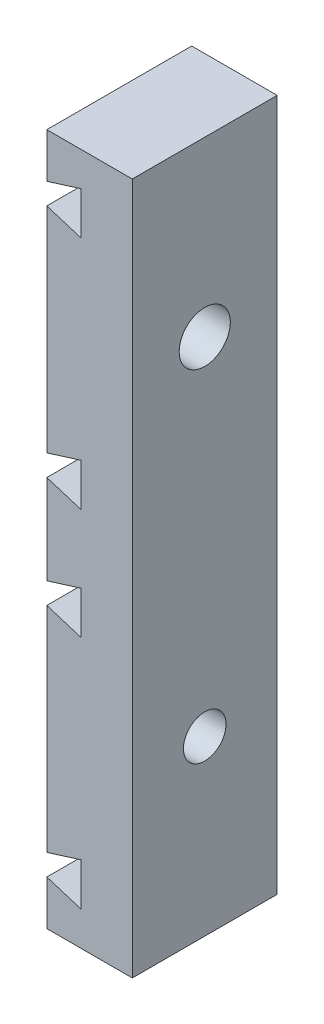
ISO-10303-21;
HEADER;
FILE_DESCRIPTION(('STEP AP214'),'2;1');
FILE_NAME('part.step','',(''),(''),'','','');
FILE_SCHEMA(('AUTOMOTIVE_DESIGN { 1 0 10303 214 1 1 1 1 }'));
ENDSEC;
DATA;
#1=APPLICATION_CONTEXT('core data for automotive mechanical design processes');
#2=APPLICATION_PROTOCOL_DEFINITION('international standard','automotive_design',2000,#1);
#3=PRODUCT_CONTEXT('',#1,'mechanical');
#4=PRODUCT('Part','Part','',(#3));
#5=PRODUCT_RELATED_PRODUCT_CATEGORY('part','',(#4));
#6=PRODUCT_DEFINITION_FORMATION('','',#4);
#7=PRODUCT_DEFINITION_CONTEXT('part definition',#1,'design');
#8=PRODUCT_DEFINITION('design','',#6,#7);
#9=PRODUCT_DEFINITION_SHAPE('','',#8);
#10=(LENGTH_UNIT() NAMED_UNIT(*) SI_UNIT(.MILLI.,.METRE.));
#11=(NAMED_UNIT(*) PLANE_ANGLE_UNIT() SI_UNIT($,.RADIAN.));
#12=(NAMED_UNIT(*) SI_UNIT($,.STERADIAN.) SOLID_ANGLE_UNIT());
#13=UNCERTAINTY_MEASURE_WITH_UNIT(LENGTH_MEASURE(1.E-05),#10,'distance_accuracy_value','');
#14=(GEOMETRIC_REPRESENTATION_CONTEXT(3) GLOBAL_UNCERTAINTY_ASSIGNED_CONTEXT((#13)) GLOBAL_UNIT_ASSIGNED_CONTEXT((#10,
#11,#12)) REPRESENTATION_CONTEXT('',''));
#15=CARTESIAN_POINT('',(0.,0.,0.));
#16=DIRECTION('',(0.,0.,1.));
#17=DIRECTION('',(1.,0.,0.));
#18=AXIS2_PLACEMENT_3D('',#15,#16,#17);
#19=CARTESIAN_POINT('',(15.1656478378989,20.3,4.25));
#20=DIRECTION('',(-1.,0.,0.));
#21=DIRECTION('',(0.,0.,1.));
#22=AXIS2_PLACEMENT_3D('',#19,#20,#21);
#23=CYLINDRICAL_SURFACE('',#22,1.5);
#24=CARTESIAN_POINT('',(15.1656478378989,20.3,4.25));
#25=DIRECTION('',(-1.,0.,0.));
#26=DIRECTION('',(0.,0.,1.));
#27=AXIS2_PLACEMENT_3D('',#24,#25,#26);
#28=CIRCLE('',#27,1.5);
#29=CARTESIAN_POINT('',(15.1656478378989,20.3,5.75));
#30=VERTEX_POINT('',#29);
#31=EDGE_CURVE('E363',#30,#30,#28,.T.);
#32=ORIENTED_EDGE('',*,*,#31,.F.);
#33=EDGE_LOOP('',(#32));
#34=FACE_BOUND('',#33,.T.);
#35=CARTESIAN_POINT('',(12.65,20.3,4.25));
#36=DIRECTION('',(-1.,0.,0.));
#37=DIRECTION('',(0.,0.,1.));
#38=AXIS2_PLACEMENT_3D('',#35,#36,#37);
#39=CIRCLE('',#38,1.5);
#40=CARTESIAN_POINT('',(12.65,20.3,5.75));
#41=VERTEX_POINT('',#40);
#42=EDGE_CURVE('E43',#41,#41,#39,.F.);
#43=ORIENTED_EDGE('',*,*,#42,.F.);
#44=EDGE_LOOP('',(#43));
#45=FACE_BOUND('',#44,.T.);
#46=ADVANCED_FACE('F39',(#34,#45),#23,.F.);
#47=CARTESIAN_POINT('',(18.65,0.,4.25));
#48=DIRECTION('',(-1.,0.,0.));
#49=DIRECTION('',(0.,0.,1.));
#50=AXIS2_PLACEMENT_3D('',#47,#48,#49);
#51=CYLINDRICAL_SURFACE('',#50,1.25);
#52=CARTESIAN_POINT('',(15.1656478378989,0.,4.25));
#53=DIRECTION('',(-1.,0.,0.));
#54=DIRECTION('',(0.,0.,1.));
#55=AXIS2_PLACEMENT_3D('',#52,#53,#54);
#56=CIRCLE('',#55,1.25);
#57=CARTESIAN_POINT('',(15.1656478378989,0.,5.5));
#58=VERTEX_POINT('',#57);
#59=EDGE_CURVE('E165',#58,#58,#56,.T.);
#60=ORIENTED_EDGE('',*,*,#59,.F.);
#61=EDGE_LOOP('',(#60));
#62=FACE_BOUND('',#61,.T.);
#63=CARTESIAN_POINT('',(12.65,0.,4.25));
#64=DIRECTION('',(-1.,0.,0.));
#65=DIRECTION('',(0.,0.,1.));
#66=AXIS2_PLACEMENT_3D('',#63,#64,#65);
#67=CIRCLE('',#66,1.25);
#68=CARTESIAN_POINT('',(12.65,0.,5.5));
#69=VERTEX_POINT('',#68);
#70=EDGE_CURVE('E217',#69,#69,#67,.F.);
#71=ORIENTED_EDGE('',*,*,#70,.F.);
#72=EDGE_LOOP('',(#71));
#73=FACE_BOUND('',#72,.T.);
#74=ADVANCED_FACE('F415',(#62,#73),#51,.F.);
#75=CARTESIAN_POINT('',(15.1656478378989,10.15,8.5));
#76=DIRECTION('',(-1.,0.,0.));
#77=DIRECTION('',(0.,0.,1.));
#78=AXIS2_PLACEMENT_3D('',#75,#76,#77);
#79=PLANE('',#78);
#80=ORIENTED_EDGE('',*,*,#31,.T.);
#81=EDGE_LOOP('',(#80));
#82=FACE_BOUND('',#81,.T.);
#83=ORIENTED_EDGE('',*,*,#59,.T.);
#84=EDGE_LOOP('',(#83));
#85=FACE_BOUND('',#84,.T.);
#86=DIRECTION('',(0.,1.,0.));
#87=VECTOR('',#86,1.);
#88=CARTESIAN_POINT('',(15.1656478378989,10.15,0.));
#89=LINE('',#88,#87);
#90=CARTESIAN_POINT('',(15.1656478378989,-10.15,0.));
#91=VERTEX_POINT('',#90);
#92=CARTESIAN_POINT('',(15.1656478378989,30.45,0.));
#93=VERTEX_POINT('',#92);
#94=EDGE_CURVE('E160',#91,#93,#89,.T.);
#95=ORIENTED_EDGE('',*,*,#94,.T.);
#96=DIRECTION('',(0.,0.,-1.));
#97=VECTOR('',#96,1.);
#98=CARTESIAN_POINT('',(15.1656478378989,30.45,8.5));
#99=LINE('',#98,#97);
#100=CARTESIAN_POINT('',(15.1656478378989,30.45,8.5));
#101=VERTEX_POINT('',#100);
#102=EDGE_CURVE('E234',#101,#93,#99,.T.);
#103=ORIENTED_EDGE('',*,*,#102,.F.);
#104=DIRECTION('',(0.,1.,0.));
#105=VECTOR('',#104,1.);
#106=CARTESIAN_POINT('',(15.1656478378989,10.15,8.5));
#107=LINE('',#106,#105);
#108=CARTESIAN_POINT('',(15.1656478378989,-10.15,8.5));
#109=VERTEX_POINT('',#108);
#110=EDGE_CURVE('E192',#109,#101,#107,.T.);
#111=ORIENTED_EDGE('',*,*,#110,.F.);
#112=DIRECTION('',(0.,0.,-1.));
#113=VECTOR('',#112,1.);
#114=CARTESIAN_POINT('',(15.1656478378989,-10.15,8.5));
#115=LINE('',#114,#113);
#116=EDGE_CURVE('E156',#109,#91,#115,.T.);
#117=ORIENTED_EDGE('',*,*,#116,.T.);
#118=EDGE_LOOP('',(#95,#103,#111,#117));
#119=FACE_BOUND('',#118,.T.);
#120=ADVANCED_FACE('F41',(#82,#85,#119),#79,.F.);
#121=CARTESIAN_POINT('',(10.15,10.15,8.5));
#122=DIRECTION('',(1.,0.,0.));
#123=DIRECTION('',(0.,0.,-1.));
#124=AXIS2_PLACEMENT_3D('',#121,#122,#123);
#125=PLANE('',#124);
#126=DIRECTION('',(0.,-1.,0.));
#127=VECTOR('',#126,1.);
#128=CARTESIAN_POINT('',(10.15,10.15,0.));
#129=LINE('',#128,#127);
#130=CARTESIAN_POINT('',(10.15,12.775,0.));
#131=VERTEX_POINT('',#130);
#132=CARTESIAN_POINT('',(10.15,7.525,0.));
#133=VERTEX_POINT('',#132);
#134=EDGE_CURVE('E164',#131,#133,#129,.T.);
#135=ORIENTED_EDGE('',*,*,#134,.T.);
#136=DIRECTION('',(0.,0.,-1.));
#137=VECTOR('',#136,1.);
#138=CARTESIAN_POINT('',(10.15,7.525,8.5));
#139=LINE('',#138,#137);
#140=CARTESIAN_POINT('',(10.15,7.525,8.5));
#141=VERTEX_POINT('',#140);
#142=EDGE_CURVE('E11',#141,#133,#139,.T.);
#143=ORIENTED_EDGE('',*,*,#142,.F.);
#144=DIRECTION('',(0.,-1.,0.));
#145=VECTOR('',#144,1.);
#146=CARTESIAN_POINT('',(10.15,10.15,8.5));
#147=LINE('',#146,#145);
#148=CARTESIAN_POINT('',(10.15,12.775,8.5));
#149=VERTEX_POINT('',#148);
#150=EDGE_CURVE('E109',#149,#141,#147,.T.);
#151=ORIENTED_EDGE('',*,*,#150,.F.);
#152=DIRECTION('',(0.,0.,-1.));
#153=VECTOR('',#152,1.);
#154=CARTESIAN_POINT('',(10.15,12.775,8.5));
#155=LINE('',#154,#153);
#156=EDGE_CURVE('E325',#149,#131,#155,.T.);
#157=ORIENTED_EDGE('',*,*,#156,.T.);
#158=EDGE_LOOP('',(#135,#143,#151,#157));
#159=FACE_BOUND('',#158,.T.);
#160=ADVANCED_FACE('F498',(#159),#125,.F.);
#161=CARTESIAN_POINT('',(12.15,8.15,8.5));
#162=DIRECTION('',(-0.298274993135945,0.95447997803503,0.));
#163=DIRECTION('',(-0.95447997803503,-0.298274993135945,0.));
#164=AXIS2_PLACEMENT_3D('',#161,#162,#163);
#165=PLANE('',#164);
#166=DIRECTION('',(0.95447997803503,0.298274993135945,0.));
#167=VECTOR('',#166,1.);
#168=CARTESIAN_POINT('',(12.15,8.15,0.));
#169=LINE('',#168,#167);
#170=CARTESIAN_POINT('',(12.15,8.15,0.));
#171=VERTEX_POINT('',#170);
#172=EDGE_CURVE('E168',#133,#171,#169,.T.);
#173=ORIENTED_EDGE('',*,*,#172,.T.);
#174=DIRECTION('',(0.,0.,-1.));
#175=VECTOR('',#174,1.);
#176=CARTESIAN_POINT('',(12.15,8.15,8.5));
#177=LINE('',#176,#175);
#178=CARTESIAN_POINT('',(12.15,8.15,8.5));
#179=VERTEX_POINT('',#178);
#180=EDGE_CURVE('E50',#179,#171,#177,.T.);
#181=ORIENTED_EDGE('',*,*,#180,.F.);
#182=DIRECTION('',(0.95447997803503,0.298274993135945,0.));
#183=VECTOR('',#182,1.);
#184=CARTESIAN_POINT('',(12.15,8.15,8.5));
#185=LINE('',#184,#183);
#186=EDGE_CURVE('E243',#141,#179,#185,.T.);
#187=ORIENTED_EDGE('',*,*,#186,.F.);
#188=ORIENTED_EDGE('',*,*,#142,.T.);
#189=EDGE_LOOP('',(#173,#181,#187,#188));
#190=FACE_BOUND('',#189,.T.);
#191=ADVANCED_FACE('F495',(#190),#165,.F.);
#192=CARTESIAN_POINT('',(12.15,8.15,8.5));
#193=DIRECTION('',(1.,0.,0.));
#194=DIRECTION('',(0.,0.,-1.));
#195=AXIS2_PLACEMENT_3D('',#192,#193,#194);
#196=PLANE('',#195);
#197=DIRECTION('',(0.,-1.,0.));
#198=VECTOR('',#197,1.);
#199=CARTESIAN_POINT('',(12.15,8.15,0.));
#200=LINE('',#199,#198);
#201=CARTESIAN_POINT('',(12.15,5.65,0.));
#202=VERTEX_POINT('',#201);
#203=EDGE_CURVE('E171',#171,#202,#200,.T.);
#204=ORIENTED_EDGE('',*,*,#203,.T.);
#205=DIRECTION('',(0.,0.,-1.));
#206=VECTOR('',#205,1.);
#207=CARTESIAN_POINT('',(12.15,5.65,8.5));
#208=LINE('',#207,#206);
#209=CARTESIAN_POINT('',(12.15,5.65,8.5));
#210=VERTEX_POINT('',#209);
#211=EDGE_CURVE('E211',#210,#202,#208,.T.);
#212=ORIENTED_EDGE('',*,*,#211,.F.);
#213=DIRECTION('',(0.,-1.,0.));
#214=VECTOR('',#213,1.);
#215=CARTESIAN_POINT('',(12.15,8.15,8.5));
#216=LINE('',#215,#214);
#217=EDGE_CURVE('E246',#179,#210,#216,.T.);
#218=ORIENTED_EDGE('',*,*,#217,.F.);
#219=ORIENTED_EDGE('',*,*,#180,.T.);
#220=EDGE_LOOP('',(#204,#212,#218,#219));
#221=FACE_BOUND('',#220,.T.);
#222=ADVANCED_FACE('F491',(#221),#196,.F.);
#223=CARTESIAN_POINT('',(12.15,5.65,8.5));
#224=DIRECTION('',(-0.298274993135947,-0.95447997803503,0.));
#225=DIRECTION('',(0.95447997803503,-0.298274993135947,0.));
#226=AXIS2_PLACEMENT_3D('',#223,#224,#225);
#227=PLANE('',#226);
#228=DIRECTION('',(-0.95447997803503,0.298274993135947,0.));
#229=VECTOR('',#228,1.);
#230=CARTESIAN_POINT('',(12.15,5.65,0.));
#231=LINE('',#230,#229);
#232=CARTESIAN_POINT('',(10.15,6.275,0.));
#233=VERTEX_POINT('',#232);
#234=EDGE_CURVE('E174',#202,#233,#231,.T.);
#235=ORIENTED_EDGE('',*,*,#234,.T.);
#236=DIRECTION('',(0.,0.,-1.));
#237=VECTOR('',#236,1.);
#238=CARTESIAN_POINT('',(10.15,6.275,8.5));
#239=LINE('',#238,#237);
#240=CARTESIAN_POINT('',(10.15,6.275,8.5));
#241=VERTEX_POINT('',#240);
#242=EDGE_CURVE('E207',#241,#233,#239,.T.);
#243=ORIENTED_EDGE('',*,*,#242,.F.);
#244=DIRECTION('',(-0.95447997803503,0.298274993135947,0.));
#245=VECTOR('',#244,1.);
#246=CARTESIAN_POINT('',(12.15,5.65,8.5));
#247=LINE('',#246,#245);
#248=EDGE_CURVE('E249',#210,#241,#247,.T.);
#249=ORIENTED_EDGE('',*,*,#248,.F.);
#250=ORIENTED_EDGE('',*,*,#211,.T.);
#251=EDGE_LOOP('',(#235,#243,#249,#250));
#252=FACE_BOUND('',#251,.T.);
#253=ADVANCED_FACE('F487',(#252),#227,.F.);
#254=CARTESIAN_POINT('',(10.15,6.275,8.5));
#255=DIRECTION('',(1.,0.,0.));
#256=DIRECTION('',(0.,0.,-1.));
#257=AXIS2_PLACEMENT_3D('',#254,#255,#256);
#258=PLANE('',#257);
#259=CARTESIAN_POINT('',(10.15,0.,4.25));
#260=DIRECTION('',(-1.,0.,0.));
#261=DIRECTION('',(0.,0.,1.));
#262=AXIS2_PLACEMENT_3D('',#259,#260,#261);
#263=CIRCLE('',#262,3.);
#264=CARTESIAN_POINT('',(10.15,0.,7.25));
#265=VERTEX_POINT('',#264);
#266=EDGE_CURVE('E228',#265,#265,#263,.T.);
#267=ORIENTED_EDGE('',*,*,#266,.F.);
#268=EDGE_LOOP('',(#267));
#269=FACE_BOUND('',#268,.T.);
#270=DIRECTION('',(0.,-1.,0.));
#271=VECTOR('',#270,1.);
#272=CARTESIAN_POINT('',(10.15,6.275,0.));
#273=LINE('',#272,#271);
#274=CARTESIAN_POINT('',(10.15,-6.275,0.));
#275=VERTEX_POINT('',#274);
#276=EDGE_CURVE('E177',#233,#275,#273,.T.);
#277=ORIENTED_EDGE('',*,*,#276,.T.);
#278=DIRECTION('',(0.,0.,-1.));
#279=VECTOR('',#278,1.);
#280=CARTESIAN_POINT('',(10.15,-6.275,8.5));
#281=LINE('',#280,#279);
#282=CARTESIAN_POINT('',(10.15,-6.275,8.5));
#283=VERTEX_POINT('',#282);
#284=EDGE_CURVE('E203',#283,#275,#281,.T.);
#285=ORIENTED_EDGE('',*,*,#284,.F.);
#286=DIRECTION('',(0.,-1.,0.));
#287=VECTOR('',#286,1.);
#288=CARTESIAN_POINT('',(10.15,6.275,8.5));
#289=LINE('',#288,#287);
#290=EDGE_CURVE('E252',#241,#283,#289,.T.);
#291=ORIENTED_EDGE('',*,*,#290,.F.);
#292=ORIENTED_EDGE('',*,*,#242,.T.);
#293=EDGE_LOOP('',(#277,#285,#291,#292));
#294=FACE_BOUND('',#293,.T.);
#295=ADVANCED_FACE('F484',(#269,#294),#258,.F.);
#296=CARTESIAN_POINT('',(12.15,-5.65,8.5));
#297=DIRECTION('',(-0.298274993135949,0.954479978035029,0.));
#298=DIRECTION('',(-0.954479978035029,-0.298274993135949,0.));
#299=AXIS2_PLACEMENT_3D('',#296,#297,#298);
#300=PLANE('',#299);
#301=DIRECTION('',(0.954479978035029,0.298274993135949,0.));
#302=VECTOR('',#301,1.);
#303=CARTESIAN_POINT('',(12.15,-5.65,0.));
#304=LINE('',#303,#302);
#305=CARTESIAN_POINT('',(12.15,-5.65,0.));
#306=VERTEX_POINT('',#305);
#307=EDGE_CURVE('E180',#275,#306,#304,.T.);
#308=ORIENTED_EDGE('',*,*,#307,.T.);
#309=DIRECTION('',(0.,0.,-1.));
#310=VECTOR('',#309,1.);
#311=CARTESIAN_POINT('',(12.15,-5.65,8.5));
#312=LINE('',#311,#310);
#313=CARTESIAN_POINT('',(12.15,-5.65,8.5));
#314=VERTEX_POINT('',#313);
#315=EDGE_CURVE('E199',#314,#306,#312,.T.);
#316=ORIENTED_EDGE('',*,*,#315,.F.);
#317=DIRECTION('',(0.954479978035029,0.298274993135949,0.));
#318=VECTOR('',#317,1.);
#319=CARTESIAN_POINT('',(12.15,-5.65,8.5));
#320=LINE('',#319,#318);
#321=EDGE_CURVE('E255',#283,#314,#320,.T.);
#322=ORIENTED_EDGE('',*,*,#321,.F.);
#323=ORIENTED_EDGE('',*,*,#284,.T.);
#324=EDGE_LOOP('',(#308,#316,#322,#323));
#325=FACE_BOUND('',#324,.T.);
#326=ADVANCED_FACE('F263',(#325),#300,.F.);
#327=CARTESIAN_POINT('',(12.15,-5.65,8.5));
#328=DIRECTION('',(1.,0.,0.));
#329=DIRECTION('',(0.,0.,-1.));
#330=AXIS2_PLACEMENT_3D('',#327,#328,#329);
#331=PLANE('',#330);
#332=DIRECTION('',(0.,-1.,0.));
#333=VECTOR('',#332,1.);
#334=CARTESIAN_POINT('',(12.15,-5.65,0.));
#335=LINE('',#334,#333);
#336=CARTESIAN_POINT('',(12.15,-8.15,0.));
#337=VERTEX_POINT('',#336);
#338=EDGE_CURVE('E183',#306,#337,#335,.T.);
#339=ORIENTED_EDGE('',*,*,#338,.T.);
#340=DIRECTION('',(0.,0.,-1.));
#341=VECTOR('',#340,1.);
#342=CARTESIAN_POINT('',(12.15,-8.15,8.5));
#343=LINE('',#342,#341);
#344=CARTESIAN_POINT('',(12.15,-8.15,8.5));
#345=VERTEX_POINT('',#344);
#346=EDGE_CURVE('E149',#345,#337,#343,.T.);
#347=ORIENTED_EDGE('',*,*,#346,.F.);
#348=DIRECTION('',(0.,-1.,0.));
#349=VECTOR('',#348,1.);
#350=CARTESIAN_POINT('',(12.15,-5.65,8.5));
#351=LINE('',#350,#349);
#352=EDGE_CURVE('E138',#314,#345,#351,.T.);
#353=ORIENTED_EDGE('',*,*,#352,.F.);
#354=ORIENTED_EDGE('',*,*,#315,.T.);
#355=EDGE_LOOP('',(#339,#347,#353,#354));
#356=FACE_BOUND('',#355,.T.);
#357=ADVANCED_FACE('F267',(#356),#331,.F.);
#358=CARTESIAN_POINT('',(12.15,-8.15,8.5));
#359=DIRECTION('',(-0.298274993135951,-0.954479978035029,0.));
#360=DIRECTION('',(0.954479978035028,-0.298274993135951,0.));
#361=AXIS2_PLACEMENT_3D('',#358,#359,#360);
#362=PLANE('',#361);
#363=DIRECTION('',(-0.954479978035028,0.298274993135951,0.));
#364=VECTOR('',#363,1.);
#365=CARTESIAN_POINT('',(12.15,-8.15,0.));
#366=LINE('',#365,#364);
#367=CARTESIAN_POINT('',(10.15,-7.525,0.));
#368=VERTEX_POINT('',#367);
#369=EDGE_CURVE('E147',#337,#368,#366,.T.);
#370=ORIENTED_EDGE('',*,*,#369,.T.);
#371=DIRECTION('',(0.,0.,-1.));
#372=VECTOR('',#371,1.);
#373=CARTESIAN_POINT('',(10.15,-7.525,8.5));
#374=LINE('',#373,#372);
#375=CARTESIAN_POINT('',(10.15,-7.525,8.5));
#376=VERTEX_POINT('',#375);
#377=EDGE_CURVE('E144',#376,#368,#374,.T.);
#378=ORIENTED_EDGE('',*,*,#377,.F.);
#379=DIRECTION('',(-0.954479978035028,0.298274993135951,0.));
#380=VECTOR('',#379,1.);
#381=CARTESIAN_POINT('',(12.15,-8.15,8.5));
#382=LINE('',#381,#380);
#383=EDGE_CURVE('E132',#345,#376,#382,.T.);
#384=ORIENTED_EDGE('',*,*,#383,.F.);
#385=ORIENTED_EDGE('',*,*,#346,.T.);
#386=EDGE_LOOP('',(#370,#378,#384,#385));
#387=FACE_BOUND('',#386,.T.);
#388=ADVANCED_FACE('F145',(#387),#362,.F.);
#389=CARTESIAN_POINT('',(10.15,-7.525,8.5));
#390=DIRECTION('',(1.,0.,0.));
#391=DIRECTION('',(0.,1.,0.));
#392=AXIS2_PLACEMENT_3D('',#389,#390,#391);
#393=PLANE('',#392);
#394=DIRECTION('',(0.,-1.,0.));
#395=VECTOR('',#394,1.);
#396=CARTESIAN_POINT('',(10.15,-7.525,0.));
#397=LINE('',#396,#395);
#398=CARTESIAN_POINT('',(10.15,-10.15,0.));
#399=VERTEX_POINT('',#398);
#400=EDGE_CURVE('E95',#368,#399,#397,.T.);
#401=ORIENTED_EDGE('',*,*,#400,.T.);
#402=DIRECTION('',(0.,0.,-1.));
#403=VECTOR('',#402,1.);
#404=CARTESIAN_POINT('',(10.15,-10.15,8.5));
#405=LINE('',#404,#403);
#406=CARTESIAN_POINT('',(10.15,-10.15,8.5));
#407=VERTEX_POINT('',#406);
#408=EDGE_CURVE('E150',#407,#399,#405,.T.);
#409=ORIENTED_EDGE('',*,*,#408,.F.);
#410=DIRECTION('',(0.,-1.,0.));
#411=VECTOR('',#410,1.);
#412=CARTESIAN_POINT('',(10.15,-7.525,8.5));
#413=LINE('',#412,#411);
#414=EDGE_CURVE('E136',#376,#407,#413,.T.);
#415=ORIENTED_EDGE('',*,*,#414,.F.);
#416=ORIENTED_EDGE('',*,*,#377,.T.);
#417=EDGE_LOOP('',(#401,#409,#415,#416));
#418=FACE_BOUND('',#417,.T.);
#419=ADVANCED_FACE('F152',(#418),#393,.F.);
#420=CARTESIAN_POINT('',(15.1656478378989,-10.15,8.5));
#421=DIRECTION('',(0.,1.,0.));
#422=DIRECTION('',(0.,0.,1.));
#423=AXIS2_PLACEMENT_3D('',#420,#421,#422);
#424=PLANE('',#423);
#425=DIRECTION('',(1.,0.,0.));
#426=VECTOR('',#425,1.);
#427=CARTESIAN_POINT('',(15.1656478378989,-10.15,0.));
#428=LINE('',#427,#426);
#429=EDGE_CURVE('E101',#399,#91,#428,.T.);
#430=ORIENTED_EDGE('',*,*,#429,.T.);
#431=ORIENTED_EDGE('',*,*,#116,.F.);
#432=DIRECTION('',(1.,0.,0.));
#433=VECTOR('',#432,1.);
#434=CARTESIAN_POINT('',(15.1656478378989,-10.15,8.5));
#435=LINE('',#434,#433);
#436=EDGE_CURVE('E59',#407,#109,#435,.T.);
#437=ORIENTED_EDGE('',*,*,#436,.F.);
#438=ORIENTED_EDGE('',*,*,#408,.T.);
#439=EDGE_LOOP('',(#430,#431,#437,#438));
#440=FACE_BOUND('',#439,.T.);
#441=ADVANCED_FACE('F471',(#440),#424,.F.);
#442=CARTESIAN_POINT('',(0.,0.,8.5));
#443=DIRECTION('',(0.,0.,-1.));
#444=DIRECTION('',(-1.,0.,0.));
#445=AXIS2_PLACEMENT_3D('',#442,#443,#444);
#446=PLANE('',#445);
#447=ORIENTED_EDGE('',*,*,#110,.T.);
#448=DIRECTION('',(1.,0.,0.));
#449=VECTOR('',#448,1.);
#450=CARTESIAN_POINT('',(15.1656478378989,30.45,8.5));
#451=LINE('',#450,#449);
#452=CARTESIAN_POINT('',(10.15,30.45,8.5));
#453=VERTEX_POINT('',#452);
#454=EDGE_CURVE('E288',#453,#101,#451,.T.);
#455=ORIENTED_EDGE('',*,*,#454,.F.);
#456=DIRECTION('',(0.,1.,0.));
#457=VECTOR('',#456,1.);
#458=CARTESIAN_POINT('',(10.15,27.825,8.5));
#459=LINE('',#458,#457);
#460=CARTESIAN_POINT('',(10.15,27.825,8.5));
#461=VERTEX_POINT('',#460);
#462=EDGE_CURVE('E391',#461,#453,#459,.T.);
#463=ORIENTED_EDGE('',*,*,#462,.F.);
#464=DIRECTION('',(-0.954479978035028,-0.298274993135951,0.));
#465=VECTOR('',#464,1.);
#466=CARTESIAN_POINT('',(12.15,28.45,8.5));
#467=LINE('',#466,#465);
#468=CARTESIAN_POINT('',(12.15,28.45,8.5));
#469=VERTEX_POINT('',#468);
#470=EDGE_CURVE('E387',#469,#461,#467,.T.);
#471=ORIENTED_EDGE('',*,*,#470,.F.);
#472=DIRECTION('',(0.,1.,0.));
#473=VECTOR('',#472,1.);
#474=CARTESIAN_POINT('',(12.15,25.95,8.5));
#475=LINE('',#474,#473);
#476=CARTESIAN_POINT('',(12.15,25.95,8.5));
#477=VERTEX_POINT('',#476);
#478=EDGE_CURVE('E383',#477,#469,#475,.T.);
#479=ORIENTED_EDGE('',*,*,#478,.F.);
#480=DIRECTION('',(0.954479978035029,-0.298274993135949,0.));
#481=VECTOR('',#480,1.);
#482=CARTESIAN_POINT('',(12.15,25.95,8.5));
#483=LINE('',#482,#481);
#484=CARTESIAN_POINT('',(10.15,26.575,8.5));
#485=VERTEX_POINT('',#484);
#486=EDGE_CURVE('E379',#485,#477,#483,.T.);
#487=ORIENTED_EDGE('',*,*,#486,.F.);
#488=DIRECTION('',(0.,1.,0.));
#489=VECTOR('',#488,1.);
#490=CARTESIAN_POINT('',(10.15,14.025,8.5));
#491=LINE('',#490,#489);
#492=CARTESIAN_POINT('',(10.15,14.025,8.5));
#493=VERTEX_POINT('',#492);
#494=EDGE_CURVE('E375',#493,#485,#491,.T.);
#495=ORIENTED_EDGE('',*,*,#494,.F.);
#496=DIRECTION('',(-0.95447997803503,-0.298274993135947,0.));
#497=VECTOR('',#496,1.);
#498=CARTESIAN_POINT('',(12.15,14.65,8.5));
#499=LINE('',#498,#497);
#500=CARTESIAN_POINT('',(12.15,14.65,8.5));
#501=VERTEX_POINT('',#500);
#502=EDGE_CURVE('E371',#501,#493,#499,.T.);
#503=ORIENTED_EDGE('',*,*,#502,.F.);
#504=DIRECTION('',(0.,1.,0.));
#505=VECTOR('',#504,1.);
#506=CARTESIAN_POINT('',(12.15,12.15,8.5));
#507=LINE('',#506,#505);
#508=CARTESIAN_POINT('',(12.15,12.15,8.5));
#509=VERTEX_POINT('',#508);
#510=EDGE_CURVE('E367',#509,#501,#507,.T.);
#511=ORIENTED_EDGE('',*,*,#510,.F.);
#512=DIRECTION('',(0.95447997803503,-0.298274993135945,0.));
#513=VECTOR('',#512,1.);
#514=CARTESIAN_POINT('',(12.15,12.15,8.5));
#515=LINE('',#514,#513);
#516=EDGE_CURVE('E329',#149,#509,#515,.T.);
#517=ORIENTED_EDGE('',*,*,#516,.F.);
#518=ORIENTED_EDGE('',*,*,#150,.T.);
#519=ORIENTED_EDGE('',*,*,#186,.T.);
#520=ORIENTED_EDGE('',*,*,#217,.T.);
#521=ORIENTED_EDGE('',*,*,#248,.T.);
#522=ORIENTED_EDGE('',*,*,#290,.T.);
#523=ORIENTED_EDGE('',*,*,#321,.T.);
#524=ORIENTED_EDGE('',*,*,#352,.T.);
#525=ORIENTED_EDGE('',*,*,#383,.T.);
#526=ORIENTED_EDGE('',*,*,#414,.T.);
#527=ORIENTED_EDGE('',*,*,#436,.T.);
#528=EDGE_LOOP('',(#447,#455,#463,#471,#479,#487,#495,#503,#511,#517,#518,#519,#520,#521,#522,
#523,#524,#525,#526,#527));
#529=FACE_BOUND('',#528,.T.);
#530=ADVANCED_FACE('F134',(#529),#446,.F.);
#531=CARTESIAN_POINT('',(0.,0.,0.));
#532=DIRECTION('',(0.,0.,-1.));
#533=DIRECTION('',(-1.,0.,0.));
#534=AXIS2_PLACEMENT_3D('',#531,#532,#533);
#535=PLANE('',#534);
#536=ORIENTED_EDGE('',*,*,#94,.F.);
#537=ORIENTED_EDGE('',*,*,#429,.F.);
#538=ORIENTED_EDGE('',*,*,#400,.F.);
#539=ORIENTED_EDGE('',*,*,#369,.F.);
#540=ORIENTED_EDGE('',*,*,#338,.F.);
#541=ORIENTED_EDGE('',*,*,#307,.F.);
#542=ORIENTED_EDGE('',*,*,#276,.F.);
#543=ORIENTED_EDGE('',*,*,#234,.F.);
#544=ORIENTED_EDGE('',*,*,#203,.F.);
#545=ORIENTED_EDGE('',*,*,#172,.F.);
#546=ORIENTED_EDGE('',*,*,#134,.F.);
#547=DIRECTION('',(0.95447997803503,-0.298274993135945,0.));
#548=VECTOR('',#547,1.);
#549=CARTESIAN_POINT('',(12.15,12.15,0.));
#550=LINE('',#549,#548);
#551=CARTESIAN_POINT('',(12.15,12.15,0.));
#552=VERTEX_POINT('',#551);
#553=EDGE_CURVE('E330',#131,#552,#550,.T.);
#554=ORIENTED_EDGE('',*,*,#553,.T.);
#555=DIRECTION('',(0.,1.,0.));
#556=VECTOR('',#555,1.);
#557=CARTESIAN_POINT('',(12.15,12.15,0.));
#558=LINE('',#557,#556);
#559=CARTESIAN_POINT('',(12.15,14.65,0.));
#560=VERTEX_POINT('',#559);
#561=EDGE_CURVE('E334',#552,#560,#558,.T.);
#562=ORIENTED_EDGE('',*,*,#561,.T.);
#563=DIRECTION('',(-0.95447997803503,-0.298274993135947,0.));
#564=VECTOR('',#563,1.);
#565=CARTESIAN_POINT('',(12.15,14.65,0.));
#566=LINE('',#565,#564);
#567=CARTESIAN_POINT('',(10.15,14.025,0.));
#568=VERTEX_POINT('',#567);
#569=EDGE_CURVE('E338',#560,#568,#566,.T.);
#570=ORIENTED_EDGE('',*,*,#569,.T.);
#571=DIRECTION('',(0.,1.,0.));
#572=VECTOR('',#571,1.);
#573=CARTESIAN_POINT('',(10.15,14.025,0.));
#574=LINE('',#573,#572);
#575=CARTESIAN_POINT('',(10.15,26.575,0.));
#576=VERTEX_POINT('',#575);
#577=EDGE_CURVE('E342',#568,#576,#574,.T.);
#578=ORIENTED_EDGE('',*,*,#577,.T.);
#579=DIRECTION('',(0.954479978035029,-0.298274993135949,0.));
#580=VECTOR('',#579,1.);
#581=CARTESIAN_POINT('',(12.15,25.95,0.));
#582=LINE('',#581,#580);
#583=CARTESIAN_POINT('',(12.15,25.95,0.));
#584=VERTEX_POINT('',#583);
#585=EDGE_CURVE('E346',#576,#584,#582,.T.);
#586=ORIENTED_EDGE('',*,*,#585,.T.);
#587=DIRECTION('',(0.,1.,0.));
#588=VECTOR('',#587,1.);
#589=CARTESIAN_POINT('',(12.15,25.95,0.));
#590=LINE('',#589,#588);
#591=CARTESIAN_POINT('',(12.15,28.45,0.));
#592=VERTEX_POINT('',#591);
#593=EDGE_CURVE('E350',#584,#592,#590,.T.);
#594=ORIENTED_EDGE('',*,*,#593,.T.);
#595=DIRECTION('',(-0.954479978035028,-0.298274993135951,0.));
#596=VECTOR('',#595,1.);
#597=CARTESIAN_POINT('',(12.15,28.45,0.));
#598=LINE('',#597,#596);
#599=CARTESIAN_POINT('',(10.15,27.825,0.));
#600=VERTEX_POINT('',#599);
#601=EDGE_CURVE('E354',#592,#600,#598,.T.);
#602=ORIENTED_EDGE('',*,*,#601,.T.);
#603=DIRECTION('',(0.,1.,0.));
#604=VECTOR('',#603,1.);
#605=CARTESIAN_POINT('',(10.15,27.825,0.));
#606=LINE('',#605,#604);
#607=CARTESIAN_POINT('',(10.15,30.45,0.));
#608=VERTEX_POINT('',#607);
#609=EDGE_CURVE('E358',#600,#608,#606,.T.);
#610=ORIENTED_EDGE('',*,*,#609,.T.);
#611=DIRECTION('',(1.,0.,0.));
#612=VECTOR('',#611,1.);
#613=CARTESIAN_POINT('',(15.1656478378989,30.45,0.));
#614=LINE('',#613,#612);
#615=EDGE_CURVE('E275',#608,#93,#614,.T.);
#616=ORIENTED_EDGE('',*,*,#615,.T.);
#617=EDGE_LOOP('',(#536,#537,#538,#539,#540,#541,#542,#543,#544,#545,#546,#554,#562,#570,#578,
#586,#594,#602,#610,#616));
#618=FACE_BOUND('',#617,.T.);
#619=ADVANCED_FACE('F270',(#618),#535,.T.);
#620=CARTESIAN_POINT('',(12.65,0.,4.25));
#621=DIRECTION('',(-1.,0.,0.));
#622=DIRECTION('',(0.,0.,1.));
#623=AXIS2_PLACEMENT_3D('',#620,#621,#622);
#624=PLANE('',#623);
#625=CARTESIAN_POINT('',(12.65,0.,4.25));
#626=DIRECTION('',(-1.,0.,0.));
#627=DIRECTION('',(0.,0.,1.));
#628=AXIS2_PLACEMENT_3D('',#625,#626,#627);
#629=CIRCLE('',#628,3.);
#630=CARTESIAN_POINT('',(12.65,0.,7.25));
#631=VERTEX_POINT('',#630);
#632=EDGE_CURVE('E220',#631,#631,#629,.T.);
#633=ORIENTED_EDGE('',*,*,#632,.T.);
#634=EDGE_LOOP('',(#633));
#635=FACE_BOUND('',#634,.T.);
#636=ORIENTED_EDGE('',*,*,#70,.T.);
#637=EDGE_LOOP('',(#636));
#638=FACE_BOUND('',#637,.T.);
#639=ADVANCED_FACE('F464',(#635,#638),#624,.T.);
#640=CARTESIAN_POINT('',(12.65,0.,4.25));
#641=DIRECTION('',(-1.,0.,0.));
#642=DIRECTION('',(0.,0.,1.));
#643=AXIS2_PLACEMENT_3D('',#640,#641,#642);
#644=CYLINDRICAL_SURFACE('',#643,3.);
#645=ORIENTED_EDGE('',*,*,#632,.F.);
#646=EDGE_LOOP('',(#645));
#647=FACE_BOUND('',#646,.T.);
#648=ORIENTED_EDGE('',*,*,#266,.T.);
#649=EDGE_LOOP('',(#648));
#650=FACE_BOUND('',#649,.T.);
#651=ADVANCED_FACE('F463',(#647,#650),#644,.F.);
#652=CARTESIAN_POINT('',(15.1656478378989,30.45,8.5));
#653=DIRECTION('',(0.,1.,0.));
#654=DIRECTION('',(0.,0.,1.));
#655=AXIS2_PLACEMENT_3D('',#652,#653,#654);
#656=PLANE('',#655);
#657=ORIENTED_EDGE('',*,*,#615,.F.);
#658=DIRECTION('',(0.,0.,-1.));
#659=VECTOR('',#658,1.);
#660=CARTESIAN_POINT('',(10.15,30.45,8.5));
#661=LINE('',#660,#659);
#662=EDGE_CURVE('E290',#453,#608,#661,.T.);
#663=ORIENTED_EDGE('',*,*,#662,.F.);
#664=ORIENTED_EDGE('',*,*,#454,.T.);
#665=ORIENTED_EDGE('',*,*,#102,.T.);
#666=EDGE_LOOP('',(#657,#663,#664,#665));
#667=FACE_BOUND('',#666,.T.);
#668=ADVANCED_FACE('F285',(#667),#656,.T.);
#669=CARTESIAN_POINT('',(10.15,27.825,8.5));
#670=DIRECTION('',(-1.,0.,0.));
#671=DIRECTION('',(0.,-1.,0.));
#672=AXIS2_PLACEMENT_3D('',#669,#670,#671);
#673=PLANE('',#672);
#674=ORIENTED_EDGE('',*,*,#609,.F.);
#675=DIRECTION('',(0.,0.,-1.));
#676=VECTOR('',#675,1.);
#677=CARTESIAN_POINT('',(10.15,27.825,8.5));
#678=LINE('',#677,#676);
#679=EDGE_CURVE('E293',#461,#600,#678,.T.);
#680=ORIENTED_EDGE('',*,*,#679,.F.);
#681=ORIENTED_EDGE('',*,*,#462,.T.);
#682=ORIENTED_EDGE('',*,*,#662,.T.);
#683=EDGE_LOOP('',(#674,#680,#681,#682));
#684=FACE_BOUND('',#683,.T.);
#685=ADVANCED_FACE('F457',(#684),#673,.T.);
#686=CARTESIAN_POINT('',(12.15,28.45,8.5));
#687=DIRECTION('',(0.298274993135951,-0.954479978035029,0.));
#688=DIRECTION('',(0.954479978035028,0.298274993135951,0.));
#689=AXIS2_PLACEMENT_3D('',#686,#687,#688);
#690=PLANE('',#689);
#691=ORIENTED_EDGE('',*,*,#601,.F.);
#692=DIRECTION('',(0.,0.,-1.));
#693=VECTOR('',#692,1.);
#694=CARTESIAN_POINT('',(12.15,28.45,8.5));
#695=LINE('',#694,#693);
#696=EDGE_CURVE('E299',#469,#592,#695,.T.);
#697=ORIENTED_EDGE('',*,*,#696,.F.);
#698=ORIENTED_EDGE('',*,*,#470,.T.);
#699=ORIENTED_EDGE('',*,*,#679,.T.);
#700=EDGE_LOOP('',(#691,#697,#698,#699));
#701=FACE_BOUND('',#700,.T.);
#702=ADVANCED_FACE('F453',(#701),#690,.T.);
#703=CARTESIAN_POINT('',(12.15,25.95,8.5));
#704=DIRECTION('',(-1.,0.,0.));
#705=DIRECTION('',(0.,0.,1.));
#706=AXIS2_PLACEMENT_3D('',#703,#704,#705);
#707=PLANE('',#706);
#708=ORIENTED_EDGE('',*,*,#593,.F.);
#709=DIRECTION('',(0.,0.,-1.));
#710=VECTOR('',#709,1.);
#711=CARTESIAN_POINT('',(12.15,25.95,8.5));
#712=LINE('',#711,#710);
#713=EDGE_CURVE('E305',#477,#584,#712,.T.);
#714=ORIENTED_EDGE('',*,*,#713,.F.);
#715=ORIENTED_EDGE('',*,*,#478,.T.);
#716=ORIENTED_EDGE('',*,*,#696,.T.);
#717=EDGE_LOOP('',(#708,#714,#715,#716));
#718=FACE_BOUND('',#717,.T.);
#719=ADVANCED_FACE('F449',(#718),#707,.T.);
#720=CARTESIAN_POINT('',(12.15,25.95,8.5));
#721=DIRECTION('',(0.298274993135949,0.954479978035029,0.));
#722=DIRECTION('',(-0.954479978035029,0.298274993135949,0.));
#723=AXIS2_PLACEMENT_3D('',#720,#721,#722);
#724=PLANE('',#723);
#725=ORIENTED_EDGE('',*,*,#585,.F.);
#726=DIRECTION('',(0.,0.,-1.));
#727=VECTOR('',#726,1.);
#728=CARTESIAN_POINT('',(10.15,26.575,8.5));
#729=LINE('',#728,#727);
#730=EDGE_CURVE('E309',#485,#576,#729,.T.);
#731=ORIENTED_EDGE('',*,*,#730,.F.);
#732=ORIENTED_EDGE('',*,*,#486,.T.);
#733=ORIENTED_EDGE('',*,*,#713,.T.);
#734=EDGE_LOOP('',(#725,#731,#732,#733));
#735=FACE_BOUND('',#734,.T.);
#736=ADVANCED_FACE('F445',(#735),#724,.T.);
#737=CARTESIAN_POINT('',(10.15,14.025,8.5));
#738=DIRECTION('',(-1.,0.,0.));
#739=DIRECTION('',(0.,0.,1.));
#740=AXIS2_PLACEMENT_3D('',#737,#738,#739);
#741=PLANE('',#740);
#742=CARTESIAN_POINT('',(10.15,20.3,4.25));
#743=DIRECTION('',(-1.,0.,0.));
#744=DIRECTION('',(0.,0.,1.));
#745=AXIS2_PLACEMENT_3D('',#742,#743,#744);
#746=CIRCLE('',#745,3.);
#747=CARTESIAN_POINT('',(10.15,20.3,7.25));
#748=VERTEX_POINT('',#747);
#749=EDGE_CURVE('E399',#748,#748,#746,.T.);
#750=ORIENTED_EDGE('',*,*,#749,.F.);
#751=EDGE_LOOP('',(#750));
#752=FACE_BOUND('',#751,.T.);
#753=ORIENTED_EDGE('',*,*,#577,.F.);
#754=DIRECTION('',(0.,0.,-1.));
#755=VECTOR('',#754,1.);
#756=CARTESIAN_POINT('',(10.15,14.025,8.5));
#757=LINE('',#756,#755);
#758=EDGE_CURVE('E313',#493,#568,#757,.T.);
#759=ORIENTED_EDGE('',*,*,#758,.F.);
#760=ORIENTED_EDGE('',*,*,#494,.T.);
#761=ORIENTED_EDGE('',*,*,#730,.T.);
#762=EDGE_LOOP('',(#753,#759,#760,#761));
#763=FACE_BOUND('',#762,.T.);
#764=ADVANCED_FACE('F441',(#752,#763),#741,.T.);
#765=CARTESIAN_POINT('',(12.15,14.65,8.5));
#766=DIRECTION('',(0.298274993135947,-0.95447997803503,0.));
#767=DIRECTION('',(0.95447997803503,0.298274993135947,0.));
#768=AXIS2_PLACEMENT_3D('',#765,#766,#767);
#769=PLANE('',#768);
#770=ORIENTED_EDGE('',*,*,#569,.F.);
#771=DIRECTION('',(0.,0.,-1.));
#772=VECTOR('',#771,1.);
#773=CARTESIAN_POINT('',(12.15,14.65,8.5));
#774=LINE('',#773,#772);
#775=EDGE_CURVE('E317',#501,#560,#774,.T.);
#776=ORIENTED_EDGE('',*,*,#775,.F.);
#777=ORIENTED_EDGE('',*,*,#502,.T.);
#778=ORIENTED_EDGE('',*,*,#758,.T.);
#779=EDGE_LOOP('',(#770,#776,#777,#778));
#780=FACE_BOUND('',#779,.T.);
#781=ADVANCED_FACE('F437',(#780),#769,.T.);
#782=CARTESIAN_POINT('',(12.15,12.15,8.5));
#783=DIRECTION('',(-1.,0.,0.));
#784=DIRECTION('',(0.,0.,1.));
#785=AXIS2_PLACEMENT_3D('',#782,#783,#784);
#786=PLANE('',#785);
#787=ORIENTED_EDGE('',*,*,#561,.F.);
#788=DIRECTION('',(0.,0.,-1.));
#789=VECTOR('',#788,1.);
#790=CARTESIAN_POINT('',(12.15,12.15,8.5));
#791=LINE('',#790,#789);
#792=EDGE_CURVE('E321',#509,#552,#791,.T.);
#793=ORIENTED_EDGE('',*,*,#792,.F.);
#794=ORIENTED_EDGE('',*,*,#510,.T.);
#795=ORIENTED_EDGE('',*,*,#775,.T.);
#796=EDGE_LOOP('',(#787,#793,#794,#795));
#797=FACE_BOUND('',#796,.T.);
#798=ADVANCED_FACE('F433',(#797),#786,.T.);
#799=CARTESIAN_POINT('',(12.15,12.15,8.5));
#800=DIRECTION('',(0.298274993135945,0.95447997803503,0.));
#801=DIRECTION('',(-0.95447997803503,0.298274993135945,0.));
#802=AXIS2_PLACEMENT_3D('',#799,#800,#801);
#803=PLANE('',#802);
#804=ORIENTED_EDGE('',*,*,#553,.F.);
#805=ORIENTED_EDGE('',*,*,#156,.F.);
#806=ORIENTED_EDGE('',*,*,#516,.T.);
#807=ORIENTED_EDGE('',*,*,#792,.T.);
#808=EDGE_LOOP('',(#804,#805,#806,#807));
#809=FACE_BOUND('',#808,.T.);
#810=ADVANCED_FACE('F430',(#809),#803,.T.);
#811=CARTESIAN_POINT('',(12.65,20.3,4.25));
#812=DIRECTION('',(-1.,0.,0.));
#813=DIRECTION('',(0.,0.,1.));
#814=AXIS2_PLACEMENT_3D('',#811,#812,#813);
#815=PLANE('',#814);
#816=CARTESIAN_POINT('',(12.65,20.3,4.25));
#817=DIRECTION('',(-1.,0.,0.));
#818=DIRECTION('',(0.,0.,1.));
#819=AXIS2_PLACEMENT_3D('',#816,#817,#818);
#820=CIRCLE('',#819,3.);
#821=CARTESIAN_POINT('',(12.65,20.3,7.25));
#822=VERTEX_POINT('',#821);
#823=EDGE_CURVE('E403',#822,#822,#820,.T.);
#824=ORIENTED_EDGE('',*,*,#823,.T.);
#825=EDGE_LOOP('',(#824));
#826=FACE_BOUND('',#825,.T.);
#827=ORIENTED_EDGE('',*,*,#42,.T.);
#828=EDGE_LOOP('',(#827));
#829=FACE_BOUND('',#828,.T.);
#830=ADVANCED_FACE('F412',(#826,#829),#815,.T.);
#831=CARTESIAN_POINT('',(12.65,20.3,4.25));
#832=DIRECTION('',(-1.,0.,0.));
#833=DIRECTION('',(0.,0.,1.));
#834=AXIS2_PLACEMENT_3D('',#831,#832,#833);
#835=CYLINDRICAL_SURFACE('',#834,3.);
#836=ORIENTED_EDGE('',*,*,#823,.F.);
#837=EDGE_LOOP('',(#836));
#838=FACE_BOUND('',#837,.T.);
#839=ORIENTED_EDGE('',*,*,#749,.T.);
#840=EDGE_LOOP('',(#839));
#841=FACE_BOUND('',#840,.T.);
#842=ADVANCED_FACE('F428',(#838,#841),#835,.F.);
#843=CLOSED_SHELL('',(#46,#74,#120,#160,#191,#222,#253,#295,#326,#357,#388,#419,#441,#530,#619,
#639,#651,#668,#685,#702,#719,#736,#764,#781,#798,#810,#830,#842));
#844=MANIFOLD_SOLID_BREP('B2',#843);
#845=ADVANCED_BREP_SHAPE_REPRESENTATION('',(#18,#844),#14);
#846=SHAPE_DEFINITION_REPRESENTATION(#9,#845);
ENDSEC;
END-ISO-10303-21;
